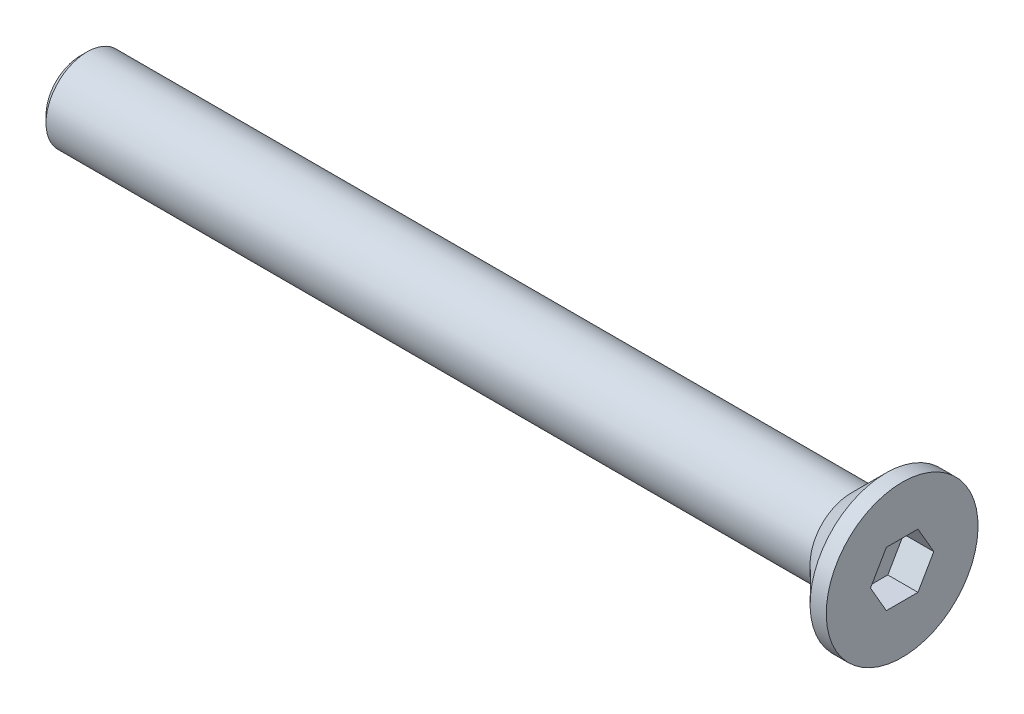
ISO-10303-21;
HEADER;
FILE_DESCRIPTION(('STEP AP214'),'2;1');
FILE_NAME('part.step','',(''),(''),'','','');
FILE_SCHEMA(('AUTOMOTIVE_DESIGN { 1 0 10303 214 1 1 1 1 }'));
ENDSEC;
DATA;
#1=APPLICATION_CONTEXT('core data for automotive mechanical design processes');
#2=APPLICATION_PROTOCOL_DEFINITION('international standard','automotive_design',2000,#1);
#3=PRODUCT_CONTEXT('',#1,'mechanical');
#4=PRODUCT('Part','Part','',(#3));
#5=PRODUCT_RELATED_PRODUCT_CATEGORY('part','',(#4));
#6=PRODUCT_DEFINITION_FORMATION('','',#4);
#7=PRODUCT_DEFINITION_CONTEXT('part definition',#1,'design');
#8=PRODUCT_DEFINITION('design','',#6,#7);
#9=PRODUCT_DEFINITION_SHAPE('','',#8);
#10=(LENGTH_UNIT() NAMED_UNIT(*) SI_UNIT(.MILLI.,.METRE.));
#11=(NAMED_UNIT(*) PLANE_ANGLE_UNIT() SI_UNIT($,.RADIAN.));
#12=(NAMED_UNIT(*) SI_UNIT($,.STERADIAN.) SOLID_ANGLE_UNIT());
#13=UNCERTAINTY_MEASURE_WITH_UNIT(LENGTH_MEASURE(1.E-05),#10,'distance_accuracy_value','');
#14=(GEOMETRIC_REPRESENTATION_CONTEXT(3) GLOBAL_UNCERTAINTY_ASSIGNED_CONTEXT((#13)) GLOBAL_UNIT_ASSIGNED_CONTEXT((#10,
#11,#12)) REPRESENTATION_CONTEXT('',''));
#15=CARTESIAN_POINT('',(0.,0.,0.));
#16=DIRECTION('',(0.,0.,1.));
#17=DIRECTION('',(1.,0.,0.));
#18=AXIS2_PLACEMENT_3D('',#15,#16,#17);
#19=CARTESIAN_POINT('',(0.,0.,0.));
#20=DIRECTION('',(1.,0.,0.));
#21=DIRECTION('',(0.,1.,0.));
#22=AXIS2_PLACEMENT_3D('',#19,#20,#21);
#23=PLANE('',#22);
#24=DIRECTION('',(0.,0.866025403784439,-0.5));
#25=VECTOR('',#24,1.);
#26=CARTESIAN_POINT('',(0.,-1.,-0.577350269189628));
#27=LINE('',#26,#25);
#28=CARTESIAN_POINT('',(0.,-1.,-0.577350269189628));
#29=VERTEX_POINT('',#28);
#30=CARTESIAN_POINT('',(0.,0.,-1.15470053837925));
#31=VERTEX_POINT('',#30);
#32=EDGE_CURVE('E31',#29,#31,#27,.T.);
#33=ORIENTED_EDGE('',*,*,#32,.F.);
#34=DIRECTION('',(0.,0.,-1.));
#35=VECTOR('',#34,1.);
#36=CARTESIAN_POINT('',(0.,-1.,0.577350269189626));
#37=LINE('',#36,#35);
#38=CARTESIAN_POINT('',(0.,-1.,0.577350269189626));
#39=VERTEX_POINT('',#38);
#40=EDGE_CURVE('E114',#39,#29,#37,.T.);
#41=ORIENTED_EDGE('',*,*,#40,.F.);
#42=DIRECTION('',(0.,-0.866025403784439,-0.5));
#43=VECTOR('',#42,1.);
#44=CARTESIAN_POINT('',(0.,0.,1.15470053837925));
#45=LINE('',#44,#43);
#46=CARTESIAN_POINT('',(0.,0.,1.15470053837925));
#47=VERTEX_POINT('',#46);
#48=EDGE_CURVE('E112',#47,#39,#45,.T.);
#49=ORIENTED_EDGE('',*,*,#48,.F.);
#50=DIRECTION('',(0.,-0.866025403784439,0.5));
#51=VECTOR('',#50,1.);
#52=CARTESIAN_POINT('',(0.,1.,0.577350269189626));
#53=LINE('',#52,#51);
#54=CARTESIAN_POINT('',(0.,1.,0.577350269189626));
#55=VERTEX_POINT('',#54);
#56=EDGE_CURVE('E79',#55,#47,#53,.T.);
#57=ORIENTED_EDGE('',*,*,#56,.F.);
#58=DIRECTION('',(0.,0.,1.));
#59=VECTOR('',#58,1.);
#60=CARTESIAN_POINT('',(0.,1.,-0.577350269189626));
#61=LINE('',#60,#59);
#62=CARTESIAN_POINT('',(0.,1.,-0.577350269189626));
#63=VERTEX_POINT('',#62);
#64=EDGE_CURVE('E108',#63,#55,#61,.T.);
#65=ORIENTED_EDGE('',*,*,#64,.F.);
#66=DIRECTION('',(0.,0.866025403784439,0.5));
#67=VECTOR('',#66,1.);
#68=CARTESIAN_POINT('',(0.,0.,-1.15470053837925));
#69=LINE('',#68,#67);
#70=EDGE_CURVE('E105',#31,#63,#69,.T.);
#71=ORIENTED_EDGE('',*,*,#70,.F.);
#72=EDGE_LOOP('',(#33,#41,#49,#57,#65,#71));
#73=FACE_BOUND('',#72,.T.);
#74=CARTESIAN_POINT('',(0.,0.,0.));
#75=DIRECTION('',(1.,0.,0.));
#76=DIRECTION('',(0.,1.,0.));
#77=AXIS2_PLACEMENT_3D('',#74,#75,#76);
#78=CIRCLE('',#77,2.77);
#79=CARTESIAN_POINT('',(0.,2.77,0.));
#80=VERTEX_POINT('',#79);
#81=EDGE_CURVE('E129',#80,#80,#78,.T.);
#82=ORIENTED_EDGE('',*,*,#81,.T.);
#83=EDGE_LOOP('',(#82));
#84=FACE_BOUND('',#83,.T.);
#85=ADVANCED_FACE('F16',(#73,#84),#23,.T.);
#86=CARTESIAN_POINT('',(0.,0.,0.));
#87=DIRECTION('',(1.,0.,0.));
#88=DIRECTION('',(0.,1.,0.));
#89=AXIS2_PLACEMENT_3D('',#86,#87,#88);
#90=CYLINDRICAL_SURFACE('',#89,2.77);
#91=CARTESIAN_POINT('',(-0.59,0.,0.));
#92=DIRECTION('',(1.,0.,0.));
#93=DIRECTION('',(0.,1.,0.));
#94=AXIS2_PLACEMENT_3D('',#91,#92,#93);
#95=CIRCLE('',#94,2.77);
#96=CARTESIAN_POINT('',(-0.59,2.77,0.));
#97=VERTEX_POINT('',#96);
#98=EDGE_CURVE('E126',#97,#97,#95,.T.);
#99=ORIENTED_EDGE('',*,*,#98,.T.);
#100=EDGE_LOOP('',(#99));
#101=FACE_BOUND('',#100,.T.);
#102=ORIENTED_EDGE('',*,*,#81,.F.);
#103=EDGE_LOOP('',(#102));
#104=FACE_BOUND('',#103,.T.);
#105=ADVANCED_FACE('F148',(#101,#104),#90,.T.);
#106=CARTESIAN_POINT('',(-0.59,0.,0.));
#107=DIRECTION('',(1.,0.,0.));
#108=DIRECTION('',(0.,1.,0.));
#109=AXIS2_PLACEMENT_3D('',#106,#107,#108);
#110=CONICAL_SURFACE('',#109,2.77,0.78539816339745);
#111=CARTESIAN_POINT('',(-1.86,0.,0.));
#112=DIRECTION('',(1.,0.,0.));
#113=DIRECTION('',(0.,1.,0.));
#114=AXIS2_PLACEMENT_3D('',#111,#112,#113);
#115=CIRCLE('',#114,1.5);
#116=CARTESIAN_POINT('',(-1.86,1.5,0.));
#117=VERTEX_POINT('',#116);
#118=EDGE_CURVE('E118',#117,#117,#115,.T.);
#119=ORIENTED_EDGE('',*,*,#118,.T.);
#120=EDGE_LOOP('',(#119));
#121=FACE_BOUND('',#120,.T.);
#122=ORIENTED_EDGE('',*,*,#98,.F.);
#123=EDGE_LOOP('',(#122));
#124=FACE_BOUND('',#123,.T.);
#125=ADVANCED_FACE('F154',(#121,#124),#110,.T.);
#126=CARTESIAN_POINT('',(0.,0.,0.));
#127=DIRECTION('',(1.,0.,0.));
#128=DIRECTION('',(0.,1.,0.));
#129=AXIS2_PLACEMENT_3D('',#126,#127,#128);
#130=CYLINDRICAL_SURFACE('',#129,1.5);
#131=CARTESIAN_POINT('',(-29.75,0.,0.));
#132=DIRECTION('',(-1.,0.,0.));
#133=DIRECTION('',(0.,-1.,0.));
#134=AXIS2_PLACEMENT_3D('',#131,#132,#133);
#135=CIRCLE('',#134,1.5);
#136=CARTESIAN_POINT('',(-29.75,-1.5,0.));
#137=VERTEX_POINT('',#136);
#138=EDGE_CURVE('E24',#137,#137,#135,.F.);
#139=ORIENTED_EDGE('',*,*,#138,.T.);
#140=EDGE_LOOP('',(#139));
#141=FACE_BOUND('',#140,.T.);
#142=ORIENTED_EDGE('',*,*,#118,.F.);
#143=EDGE_LOOP('',(#142));
#144=FACE_BOUND('',#143,.T.);
#145=ADVANCED_FACE('F134',(#141,#144),#130,.T.);
#146=CARTESIAN_POINT('',(-30.,1.5,0.));
#147=DIRECTION('',(-1.,0.,0.));
#148=DIRECTION('',(0.,-1.,0.));
#149=AXIS2_PLACEMENT_3D('',#146,#147,#148);
#150=PLANE('',#149);
#151=CARTESIAN_POINT('',(-30.,0.,0.));
#152=DIRECTION('',(-1.,0.,0.));
#153=DIRECTION('',(0.,-1.,0.));
#154=AXIS2_PLACEMENT_3D('',#151,#152,#153);
#155=CIRCLE('',#154,1.25);
#156=CARTESIAN_POINT('',(-30.,-1.25,0.));
#157=VERTEX_POINT('',#156);
#158=EDGE_CURVE('E10',#157,#157,#155,.T.);
#159=ORIENTED_EDGE('',*,*,#158,.T.);
#160=EDGE_LOOP('',(#159));
#161=FACE_BOUND('',#160,.T.);
#162=ADVANCED_FACE('F164',(#161),#150,.T.);
#163=CARTESIAN_POINT('',(-1.1,-1.,-0.577350269189628));
#164=DIRECTION('',(0.,-0.5,-0.866025403784439));
#165=DIRECTION('',(0.,0.866025403784439,-0.5));
#166=AXIS2_PLACEMENT_3D('',#163,#164,#165);
#167=PLANE('',#166);
#168=ORIENTED_EDGE('',*,*,#32,.T.);
#169=DIRECTION('',(1.,0.,0.));
#170=VECTOR('',#169,1.);
#171=CARTESIAN_POINT('',(-1.1,0.,-1.15470053837925));
#172=LINE('',#171,#170);
#173=CARTESIAN_POINT('',(-1.1,0.,-1.15470053837925));
#174=VERTEX_POINT('',#173);
#175=EDGE_CURVE('E61',#174,#31,#172,.T.);
#176=ORIENTED_EDGE('',*,*,#175,.F.);
#177=DIRECTION('',(0.,0.866025403784439,-0.5));
#178=VECTOR('',#177,1.);
#179=CARTESIAN_POINT('',(-1.1,-1.,-0.577350269189628));
#180=LINE('',#179,#178);
#181=CARTESIAN_POINT('',(-1.1,-1.,-0.577350269189628));
#182=VERTEX_POINT('',#181);
#183=EDGE_CURVE('E116',#182,#174,#180,.T.);
#184=ORIENTED_EDGE('',*,*,#183,.F.);
#185=DIRECTION('',(1.,0.,0.));
#186=VECTOR('',#185,1.);
#187=CARTESIAN_POINT('',(-1.1,-1.,-0.577350269189628));
#188=LINE('',#187,#186);
#189=EDGE_CURVE('E39',#182,#29,#188,.T.);
#190=ORIENTED_EDGE('',*,*,#189,.T.);
#191=EDGE_LOOP('',(#168,#176,#184,#190));
#192=FACE_BOUND('',#191,.T.);
#193=ADVANCED_FACE('F167',(#192),#167,.F.);
#194=CARTESIAN_POINT('',(-1.1,-1.,0.577350269189626));
#195=DIRECTION('',(0.,-1.,0.));
#196=DIRECTION('',(0.,0.,-1.));
#197=AXIS2_PLACEMENT_3D('',#194,#195,#196);
#198=PLANE('',#197);
#199=ORIENTED_EDGE('',*,*,#40,.T.);
#200=ORIENTED_EDGE('',*,*,#189,.F.);
#201=DIRECTION('',(0.,0.,-1.));
#202=VECTOR('',#201,1.);
#203=CARTESIAN_POINT('',(-1.1,-1.,0.577350269189626));
#204=LINE('',#203,#202);
#205=CARTESIAN_POINT('',(-1.1,-1.,0.577350269189626));
#206=VERTEX_POINT('',#205);
#207=EDGE_CURVE('E91',#206,#182,#204,.T.);
#208=ORIENTED_EDGE('',*,*,#207,.F.);
#209=DIRECTION('',(1.,0.,0.));
#210=VECTOR('',#209,1.);
#211=CARTESIAN_POINT('',(-1.1,-1.,0.577350269189626));
#212=LINE('',#211,#210);
#213=EDGE_CURVE('E83',#206,#39,#212,.T.);
#214=ORIENTED_EDGE('',*,*,#213,.T.);
#215=EDGE_LOOP('',(#199,#200,#208,#214));
#216=FACE_BOUND('',#215,.T.);
#217=ADVANCED_FACE('F171',(#216),#198,.F.);
#218=CARTESIAN_POINT('',(-1.1,0.,1.15470053837925));
#219=DIRECTION('',(0.,-0.5,0.866025403784439));
#220=DIRECTION('',(0.,-0.866025403784439,-0.5));
#221=AXIS2_PLACEMENT_3D('',#218,#219,#220);
#222=PLANE('',#221);
#223=ORIENTED_EDGE('',*,*,#48,.T.);
#224=ORIENTED_EDGE('',*,*,#213,.F.);
#225=DIRECTION('',(0.,-0.866025403784439,-0.5));
#226=VECTOR('',#225,1.);
#227=CARTESIAN_POINT('',(-1.1,0.,1.15470053837925));
#228=LINE('',#227,#226);
#229=CARTESIAN_POINT('',(-1.1,0.,1.15470053837925));
#230=VERTEX_POINT('',#229);
#231=EDGE_CURVE('E87',#230,#206,#228,.T.);
#232=ORIENTED_EDGE('',*,*,#231,.F.);
#233=DIRECTION('',(1.,0.,0.));
#234=VECTOR('',#233,1.);
#235=CARTESIAN_POINT('',(-1.1,0.,1.15470053837925));
#236=LINE('',#235,#234);
#237=EDGE_CURVE('E72',#230,#47,#236,.T.);
#238=ORIENTED_EDGE('',*,*,#237,.T.);
#239=EDGE_LOOP('',(#223,#224,#232,#238));
#240=FACE_BOUND('',#239,.T.);
#241=ADVANCED_FACE('F88',(#240),#222,.F.);
#242=CARTESIAN_POINT('',(-1.1,1.,0.577350269189626));
#243=DIRECTION('',(0.,0.5,0.866025403784439));
#244=DIRECTION('',(0.,-0.866025403784439,0.5));
#245=AXIS2_PLACEMENT_3D('',#242,#243,#244);
#246=PLANE('',#245);
#247=ORIENTED_EDGE('',*,*,#56,.T.);
#248=ORIENTED_EDGE('',*,*,#237,.F.);
#249=DIRECTION('',(0.,-0.866025403784439,0.5));
#250=VECTOR('',#249,1.);
#251=CARTESIAN_POINT('',(-1.1,1.,0.577350269189626));
#252=LINE('',#251,#250);
#253=CARTESIAN_POINT('',(-1.1,1.,0.577350269189626));
#254=VERTEX_POINT('',#253);
#255=EDGE_CURVE('E76',#254,#230,#252,.T.);
#256=ORIENTED_EDGE('',*,*,#255,.F.);
#257=DIRECTION('',(1.,0.,0.));
#258=VECTOR('',#257,1.);
#259=CARTESIAN_POINT('',(-1.1,1.,0.577350269189626));
#260=LINE('',#259,#258);
#261=EDGE_CURVE('E84',#254,#55,#260,.T.);
#262=ORIENTED_EDGE('',*,*,#261,.T.);
#263=EDGE_LOOP('',(#247,#248,#256,#262));
#264=FACE_BOUND('',#263,.T.);
#265=ADVANCED_FACE('F74',(#264),#246,.F.);
#266=CARTESIAN_POINT('',(-1.1,1.,-0.577350269189626));
#267=DIRECTION('',(0.,1.,0.));
#268=DIRECTION('',(-1.,0.,0.));
#269=AXIS2_PLACEMENT_3D('',#266,#267,#268);
#270=PLANE('',#269);
#271=ORIENTED_EDGE('',*,*,#64,.T.);
#272=ORIENTED_EDGE('',*,*,#261,.F.);
#273=DIRECTION('',(0.,0.,1.));
#274=VECTOR('',#273,1.);
#275=CARTESIAN_POINT('',(-1.1,1.,-0.577350269189626));
#276=LINE('',#275,#274);
#277=CARTESIAN_POINT('',(-1.1,1.,-0.577350269189626));
#278=VERTEX_POINT('',#277);
#279=EDGE_CURVE('E97',#278,#254,#276,.T.);
#280=ORIENTED_EDGE('',*,*,#279,.F.);
#281=DIRECTION('',(1.,0.,0.));
#282=VECTOR('',#281,1.);
#283=CARTESIAN_POINT('',(-1.1,1.,-0.577350269189626));
#284=LINE('',#283,#282);
#285=EDGE_CURVE('E121',#278,#63,#284,.T.);
#286=ORIENTED_EDGE('',*,*,#285,.T.);
#287=EDGE_LOOP('',(#271,#272,#280,#286));
#288=FACE_BOUND('',#287,.T.);
#289=ADVANCED_FACE('F174',(#288),#270,.F.);
#290=CARTESIAN_POINT('',(-1.1,0.,-1.15470053837925));
#291=DIRECTION('',(0.,0.5,-0.866025403784439));
#292=DIRECTION('',(0.,0.866025403784439,0.5));
#293=AXIS2_PLACEMENT_3D('',#290,#291,#292);
#294=PLANE('',#293);
#295=ORIENTED_EDGE('',*,*,#70,.T.);
#296=ORIENTED_EDGE('',*,*,#285,.F.);
#297=DIRECTION('',(0.,0.866025403784439,0.5));
#298=VECTOR('',#297,1.);
#299=CARTESIAN_POINT('',(-1.1,0.,-1.15470053837925));
#300=LINE('',#299,#298);
#301=EDGE_CURVE('E99',#174,#278,#300,.T.);
#302=ORIENTED_EDGE('',*,*,#301,.F.);
#303=ORIENTED_EDGE('',*,*,#175,.T.);
#304=EDGE_LOOP('',(#295,#296,#302,#303));
#305=FACE_BOUND('',#304,.T.);
#306=ADVANCED_FACE('F144',(#305),#294,.F.);
#307=CARTESIAN_POINT('',(-1.1,-2.,0.));
#308=DIRECTION('',(-1.,0.,0.));
#309=DIRECTION('',(0.,-1.,0.));
#310=AXIS2_PLACEMENT_3D('',#307,#308,#309);
#311=PLANE('',#310);
#312=ORIENTED_EDGE('',*,*,#183,.T.);
#313=ORIENTED_EDGE('',*,*,#301,.T.);
#314=ORIENTED_EDGE('',*,*,#279,.T.);
#315=ORIENTED_EDGE('',*,*,#255,.T.);
#316=ORIENTED_EDGE('',*,*,#231,.T.);
#317=ORIENTED_EDGE('',*,*,#207,.T.);
#318=EDGE_LOOP('',(#312,#313,#314,#315,#316,#317));
#319=FACE_BOUND('',#318,.T.);
#320=ADVANCED_FACE('F94',(#319),#311,.F.);
#321=CARTESIAN_POINT('',(-29.75,0.,0.));
#322=DIRECTION('',(1.,0.,0.));
#323=DIRECTION('',(0.,1.,0.));
#324=AXIS2_PLACEMENT_3D('',#321,#322,#323);
#325=CONICAL_SURFACE('',#324,1.5,0.785398163397445);
#326=ORIENTED_EDGE('',*,*,#158,.F.);
#327=EDGE_LOOP('',(#326));
#328=FACE_BOUND('',#327,.T.);
#329=ORIENTED_EDGE('',*,*,#138,.F.);
#330=EDGE_LOOP('',(#329));
#331=FACE_BOUND('',#330,.T.);
#332=ADVANCED_FACE('F18',(#328,#331),#325,.T.);
#333=CLOSED_SHELL('',(#85,#105,#125,#145,#162,#193,#217,#241,#265,#289,#306,#320,#332));
#334=MANIFOLD_SOLID_BREP('B1',#333);
#335=ADVANCED_BREP_SHAPE_REPRESENTATION('',(#18,#334),#14);
#336=SHAPE_DEFINITION_REPRESENTATION(#9,#335);
ENDSEC;
END-ISO-10303-21;
